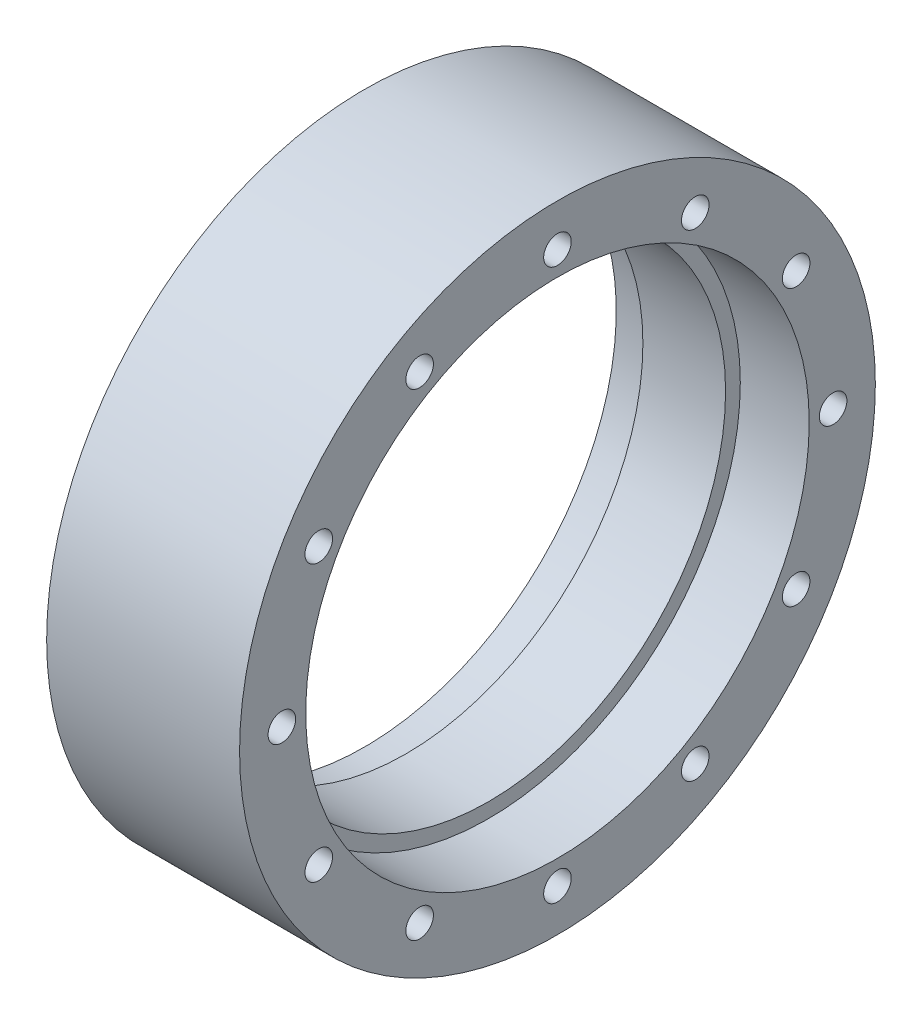
ISO-10303-21;
HEADER;
FILE_DESCRIPTION(('STEP AP214'),'2;1');
FILE_NAME('part.step','',(''),(''),'','','');
FILE_SCHEMA(('AUTOMOTIVE_DESIGN { 1 0 10303 214 1 1 1 1 }'));
ENDSEC;
DATA;
#1=APPLICATION_CONTEXT('core data for automotive mechanical design processes');
#2=APPLICATION_PROTOCOL_DEFINITION('international standard','automotive_design',2000,#1);
#3=PRODUCT_CONTEXT('',#1,'mechanical');
#4=PRODUCT('Part','Part','',(#3));
#5=PRODUCT_RELATED_PRODUCT_CATEGORY('part','',(#4));
#6=PRODUCT_DEFINITION_FORMATION('','',#4);
#7=PRODUCT_DEFINITION_CONTEXT('part definition',#1,'design');
#8=PRODUCT_DEFINITION('design','',#6,#7);
#9=PRODUCT_DEFINITION_SHAPE('','',#8);
#10=(LENGTH_UNIT() NAMED_UNIT(*) SI_UNIT(.MILLI.,.METRE.));
#11=(NAMED_UNIT(*) PLANE_ANGLE_UNIT() SI_UNIT($,.RADIAN.));
#12=(NAMED_UNIT(*) SI_UNIT($,.STERADIAN.) SOLID_ANGLE_UNIT());
#13=UNCERTAINTY_MEASURE_WITH_UNIT(LENGTH_MEASURE(1.E-05),#10,'distance_accuracy_value','');
#14=(GEOMETRIC_REPRESENTATION_CONTEXT(3) GLOBAL_UNCERTAINTY_ASSIGNED_CONTEXT((#13)) GLOBAL_UNIT_ASSIGNED_CONTEXT((#10,
#11,#12)) REPRESENTATION_CONTEXT('',''));
#15=CARTESIAN_POINT('',(0.,0.,0.));
#16=DIRECTION('',(0.,0.,1.));
#17=DIRECTION('',(1.,0.,0.));
#18=AXIS2_PLACEMENT_3D('',#15,#16,#17);
#19=CARTESIAN_POINT('',(12.7,0.,0.));
#20=DIRECTION('',(-1.,0.,0.));
#21=DIRECTION('',(0.,0.,1.));
#22=AXIS2_PLACEMENT_3D('',#19,#20,#21);
#23=CYLINDRICAL_SURFACE('',#22,29.);
#24=CARTESIAN_POINT('',(-4.7625,0.,0.));
#25=DIRECTION('',(1.,0.,0.));
#26=DIRECTION('',(0.,0.,-1.));
#27=AXIS2_PLACEMENT_3D('',#24,#25,#26);
#28=CIRCLE('',#27,29.);
#29=CARTESIAN_POINT('',(-4.7625,0.,-29.));
#30=VERTEX_POINT('',#29);
#31=EDGE_CURVE('E47',#30,#30,#28,.T.);
#32=ORIENTED_EDGE('',*,*,#31,.T.);
#33=EDGE_LOOP('',(#32));
#34=FACE_BOUND('',#33,.T.);
#35=CARTESIAN_POINT('',(-9.525,0.,0.));
#36=DIRECTION('',(-1.,0.,0.));
#37=DIRECTION('',(0.,0.,1.));
#38=AXIS2_PLACEMENT_3D('',#35,#36,#37);
#39=CIRCLE('',#38,29.);
#40=CARTESIAN_POINT('',(-9.525,0.,29.));
#41=VERTEX_POINT('',#40);
#42=EDGE_CURVE('E91',#41,#41,#39,.T.);
#43=ORIENTED_EDGE('',*,*,#42,.T.);
#44=EDGE_LOOP('',(#43));
#45=FACE_BOUND('',#44,.T.);
#46=ADVANCED_FACE('F31',(#34,#45),#23,.F.);
#47=CARTESIAN_POINT('',(12.7,0.,0.));
#48=DIRECTION('',(-1.,0.,0.));
#49=DIRECTION('',(0.,0.,1.));
#50=AXIS2_PLACEMENT_3D('',#47,#48,#49);
#51=CYLINDRICAL_SURFACE('',#50,36.62);
#52=CARTESIAN_POINT('',(12.7,0.,0.));
#53=DIRECTION('',(1.,0.,0.));
#54=DIRECTION('',(0.,0.,-1.));
#55=AXIS2_PLACEMENT_3D('',#52,#53,#54);
#56=CIRCLE('',#55,36.62);
#57=CARTESIAN_POINT('',(12.7,0.,-36.62));
#58=VERTEX_POINT('',#57);
#59=EDGE_CURVE('E39',#58,#58,#56,.T.);
#60=ORIENTED_EDGE('',*,*,#59,.F.);
#61=EDGE_LOOP('',(#60));
#62=FACE_BOUND('',#61,.T.);
#63=CARTESIAN_POINT('',(-9.525,0.,0.));
#64=DIRECTION('',(-1.,0.,0.));
#65=DIRECTION('',(0.,0.,1.));
#66=AXIS2_PLACEMENT_3D('',#63,#64,#65);
#67=CIRCLE('',#66,36.62);
#68=CARTESIAN_POINT('',(-9.525,0.,36.62));
#69=VERTEX_POINT('',#68);
#70=EDGE_CURVE('E100',#69,#69,#67,.T.);
#71=ORIENTED_EDGE('',*,*,#70,.F.);
#72=EDGE_LOOP('',(#71));
#73=FACE_BOUND('',#72,.T.);
#74=ADVANCED_FACE('F33',(#62,#73),#51,.T.);
#75=CARTESIAN_POINT('',(-12.7,27.4963065701561,15.8749999999997));
#76=DIRECTION('',(1.,0.,0.));
#77=DIRECTION('',(0.,0.,-1.));
#78=AXIS2_PLACEMENT_3D('',#75,#76,#77);
#79=CYLINDRICAL_SURFACE('',#78,1.5875);
#80=CARTESIAN_POINT('',(12.7,27.4963065701561,15.8749999999997));
#81=DIRECTION('',(1.,0.,0.));
#82=DIRECTION('',(0.,0.,-1.));
#83=AXIS2_PLACEMENT_3D('',#80,#81,#82);
#84=CIRCLE('',#83,1.5875);
#85=CARTESIAN_POINT('',(12.7,27.4963065701561,14.2874999999997));
#86=VERTEX_POINT('',#85);
#87=EDGE_CURVE('E75',#86,#86,#84,.T.);
#88=ORIENTED_EDGE('',*,*,#87,.T.);
#89=EDGE_LOOP('',(#88));
#90=FACE_BOUND('',#89,.T.);
#91=CARTESIAN_POINT('',(-9.525,27.4963065701561,15.8749999999997));
#92=DIRECTION('',(-1.,0.,0.));
#93=DIRECTION('',(0.,0.,1.));
#94=AXIS2_PLACEMENT_3D('',#91,#92,#93);
#95=CIRCLE('',#94,1.5875);
#96=CARTESIAN_POINT('',(-9.525,27.4963065701561,17.4624999999997));
#97=VERTEX_POINT('',#96);
#98=EDGE_CURVE('E103',#97,#97,#95,.F.);
#99=ORIENTED_EDGE('',*,*,#98,.F.);
#100=EDGE_LOOP('',(#99));
#101=FACE_BOUND('',#100,.T.);
#102=ADVANCED_FACE('F167',(#90,#101),#79,.F.);
#103=CARTESIAN_POINT('',(-12.7,15.8750000000002,27.4963065701558));
#104=DIRECTION('',(1.,0.,0.));
#105=DIRECTION('',(0.,0.,-1.));
#106=AXIS2_PLACEMENT_3D('',#103,#104,#105);
#107=CYLINDRICAL_SURFACE('',#106,1.5875);
#108=CARTESIAN_POINT('',(12.7,15.8750000000002,27.4963065701558));
#109=DIRECTION('',(1.,0.,0.));
#110=DIRECTION('',(0.,0.,-1.));
#111=AXIS2_PLACEMENT_3D('',#108,#109,#110);
#112=CIRCLE('',#111,1.5875);
#113=CARTESIAN_POINT('',(12.7,15.8750000000002,25.9088065701558));
#114=VERTEX_POINT('',#113);
#115=EDGE_CURVE('E78',#114,#114,#112,.T.);
#116=ORIENTED_EDGE('',*,*,#115,.T.);
#117=EDGE_LOOP('',(#116));
#118=FACE_BOUND('',#117,.T.);
#119=CARTESIAN_POINT('',(-9.525,15.8750000000002,27.4963065701558));
#120=DIRECTION('',(-1.,0.,0.));
#121=DIRECTION('',(0.,0.,1.));
#122=AXIS2_PLACEMENT_3D('',#119,#120,#121);
#123=CIRCLE('',#122,1.5875);
#124=CARTESIAN_POINT('',(-9.525,15.8750000000002,29.0838065701558));
#125=VERTEX_POINT('',#124);
#126=EDGE_CURVE('E106',#125,#125,#123,.F.);
#127=ORIENTED_EDGE('',*,*,#126,.F.);
#128=EDGE_LOOP('',(#127));
#129=FACE_BOUND('',#128,.T.);
#130=ADVANCED_FACE('F212',(#118,#129),#107,.F.);
#131=CARTESIAN_POINT('',(-12.7,2.21709065016539E-13,31.75));
#132=DIRECTION('',(1.,0.,0.));
#133=DIRECTION('',(0.,0.,-1.));
#134=AXIS2_PLACEMENT_3D('',#131,#132,#133);
#135=CYLINDRICAL_SURFACE('',#134,1.5875);
#136=CARTESIAN_POINT('',(12.7,2.21709065016539E-13,31.75));
#137=DIRECTION('',(1.,0.,0.));
#138=DIRECTION('',(0.,0.,-1.));
#139=AXIS2_PLACEMENT_3D('',#136,#137,#138);
#140=CIRCLE('',#139,1.5875);
#141=CARTESIAN_POINT('',(12.7,2.21709065016539E-13,30.1625));
#142=VERTEX_POINT('',#141);
#143=EDGE_CURVE('E82',#142,#142,#140,.T.);
#144=ORIENTED_EDGE('',*,*,#143,.T.);
#145=EDGE_LOOP('',(#144));
#146=FACE_BOUND('',#145,.T.);
#147=CARTESIAN_POINT('',(-9.525,2.21709065016539E-13,31.75));
#148=DIRECTION('',(-1.,0.,0.));
#149=DIRECTION('',(0.,0.,1.));
#150=AXIS2_PLACEMENT_3D('',#147,#148,#149);
#151=CIRCLE('',#150,1.5875);
#152=CARTESIAN_POINT('',(-9.525,2.21709065016539E-13,33.3375));
#153=VERTEX_POINT('',#152);
#154=EDGE_CURVE('E109',#153,#153,#151,.F.);
#155=ORIENTED_EDGE('',*,*,#154,.F.);
#156=EDGE_LOOP('',(#155));
#157=FACE_BOUND('',#156,.T.);
#158=ADVANCED_FACE('F216',(#146,#157),#135,.F.);
#159=CARTESIAN_POINT('',(-12.7,-15.8749999999998,27.496306570156));
#160=DIRECTION('',(1.,0.,0.));
#161=DIRECTION('',(0.,0.,-1.));
#162=AXIS2_PLACEMENT_3D('',#159,#160,#161);
#163=CYLINDRICAL_SURFACE('',#162,1.5875);
#164=CARTESIAN_POINT('',(12.7,-15.8749999999998,27.496306570156));
#165=DIRECTION('',(1.,0.,0.));
#166=DIRECTION('',(0.,0.,-1.));
#167=AXIS2_PLACEMENT_3D('',#164,#165,#166);
#168=CIRCLE('',#167,1.5875);
#169=CARTESIAN_POINT('',(12.7,-15.8749999999998,25.908806570156));
#170=VERTEX_POINT('',#169);
#171=EDGE_CURVE('E66',#170,#170,#168,.T.);
#172=ORIENTED_EDGE('',*,*,#171,.T.);
#173=EDGE_LOOP('',(#172));
#174=FACE_BOUND('',#173,.T.);
#175=CARTESIAN_POINT('',(-9.525,-15.8749999999998,27.496306570156));
#176=DIRECTION('',(-1.,0.,0.));
#177=DIRECTION('',(0.,0.,1.));
#178=AXIS2_PLACEMENT_3D('',#175,#176,#177);
#179=CIRCLE('',#178,1.5875);
#180=CARTESIAN_POINT('',(-9.525,-15.8749999999998,29.083806570156));
#181=VERTEX_POINT('',#180);
#182=EDGE_CURVE('E112',#181,#181,#179,.F.);
#183=ORIENTED_EDGE('',*,*,#182,.F.);
#184=EDGE_LOOP('',(#183));
#185=FACE_BOUND('',#184,.T.);
#186=ADVANCED_FACE('F196',(#174,#185),#163,.F.);
#187=CARTESIAN_POINT('',(-12.7,-27.4963065701559,15.8750000000001));
#188=DIRECTION('',(1.,0.,0.));
#189=DIRECTION('',(0.,0.,-1.));
#190=AXIS2_PLACEMENT_3D('',#187,#188,#189);
#191=CYLINDRICAL_SURFACE('',#190,1.5875);
#192=CARTESIAN_POINT('',(12.7,-27.4963065701559,15.8750000000001));
#193=DIRECTION('',(1.,0.,0.));
#194=DIRECTION('',(0.,0.,-1.));
#195=AXIS2_PLACEMENT_3D('',#192,#193,#194);
#196=CIRCLE('',#195,1.5875);
#197=CARTESIAN_POINT('',(12.7,-27.4963065701559,14.2875000000001));
#198=VERTEX_POINT('',#197);
#199=EDGE_CURVE('E62',#198,#198,#196,.T.);
#200=ORIENTED_EDGE('',*,*,#199,.T.);
#201=EDGE_LOOP('',(#200));
#202=FACE_BOUND('',#201,.T.);
#203=CARTESIAN_POINT('',(-9.525,-27.4963065701559,15.8750000000001));
#204=DIRECTION('',(-1.,0.,0.));
#205=DIRECTION('',(0.,0.,1.));
#206=AXIS2_PLACEMENT_3D('',#203,#204,#205);
#207=CIRCLE('',#206,1.5875);
#208=CARTESIAN_POINT('',(-9.525,-27.4963065701559,17.4625000000001));
#209=VERTEX_POINT('',#208);
#210=EDGE_CURVE('E115',#209,#209,#207,.F.);
#211=ORIENTED_EDGE('',*,*,#210,.F.);
#212=EDGE_LOOP('',(#211));
#213=FACE_BOUND('',#212,.T.);
#214=ADVANCED_FACE('F192',(#202,#213),#191,.F.);
#215=CARTESIAN_POINT('',(-12.7,-31.75,1.10854532508269E-13));
#216=DIRECTION('',(1.,0.,0.));
#217=DIRECTION('',(0.,0.,-1.));
#218=AXIS2_PLACEMENT_3D('',#215,#216,#217);
#219=CYLINDRICAL_SURFACE('',#218,1.5875);
#220=CARTESIAN_POINT('',(12.7,-31.75,1.10854532508269E-13));
#221=DIRECTION('',(1.,0.,0.));
#222=DIRECTION('',(0.,0.,-1.));
#223=AXIS2_PLACEMENT_3D('',#220,#221,#222);
#224=CIRCLE('',#223,1.5875);
#225=CARTESIAN_POINT('',(12.7,-31.75,-1.58749999999989));
#226=VERTEX_POINT('',#225);
#227=EDGE_CURVE('E65',#226,#226,#224,.T.);
#228=ORIENTED_EDGE('',*,*,#227,.T.);
#229=EDGE_LOOP('',(#228));
#230=FACE_BOUND('',#229,.T.);
#231=CARTESIAN_POINT('',(-9.525,-31.75,1.10854532508269E-13));
#232=DIRECTION('',(-1.,0.,0.));
#233=DIRECTION('',(0.,0.,1.));
#234=AXIS2_PLACEMENT_3D('',#231,#232,#233);
#235=CIRCLE('',#234,1.5875);
#236=CARTESIAN_POINT('',(-9.525,-31.75,1.58750000000011));
#237=VERTEX_POINT('',#236);
#238=EDGE_CURVE('E118',#237,#237,#235,.F.);
#239=ORIENTED_EDGE('',*,*,#238,.F.);
#240=EDGE_LOOP('',(#239));
#241=FACE_BOUND('',#240,.T.);
#242=ADVANCED_FACE('F195',(#230,#241),#219,.F.);
#243=CARTESIAN_POINT('',(-12.7,-27.496306570156,-15.8749999999999));
#244=DIRECTION('',(1.,0.,0.));
#245=DIRECTION('',(0.,0.,-1.));
#246=AXIS2_PLACEMENT_3D('',#243,#244,#245);
#247=CYLINDRICAL_SURFACE('',#246,1.5875);
#248=CARTESIAN_POINT('',(12.7,-27.496306570156,-15.8749999999999));
#249=DIRECTION('',(1.,0.,0.));
#250=DIRECTION('',(0.,0.,-1.));
#251=AXIS2_PLACEMENT_3D('',#248,#249,#250);
#252=CIRCLE('',#251,1.5875);
#253=CARTESIAN_POINT('',(12.7,-27.496306570156,-17.4624999999999));
#254=VERTEX_POINT('',#253);
#255=EDGE_CURVE('E69',#254,#254,#252,.T.);
#256=ORIENTED_EDGE('',*,*,#255,.T.);
#257=EDGE_LOOP('',(#256));
#258=FACE_BOUND('',#257,.T.);
#259=CARTESIAN_POINT('',(-9.525,-27.496306570156,-15.8749999999999));
#260=DIRECTION('',(-1.,0.,0.));
#261=DIRECTION('',(0.,0.,1.));
#262=AXIS2_PLACEMENT_3D('',#259,#260,#261);
#263=CIRCLE('',#262,1.5875);
#264=CARTESIAN_POINT('',(-9.525,-27.496306570156,-14.2874999999999));
#265=VERTEX_POINT('',#264);
#266=EDGE_CURVE('E121',#265,#265,#263,.F.);
#267=ORIENTED_EDGE('',*,*,#266,.F.);
#268=EDGE_LOOP('',(#267));
#269=FACE_BOUND('',#268,.T.);
#270=ADVANCED_FACE('F200',(#258,#269),#247,.F.);
#271=CARTESIAN_POINT('',(-12.7,-15.875,-27.4963065701559));
#272=DIRECTION('',(1.,0.,0.));
#273=DIRECTION('',(0.,0.,-1.));
#274=AXIS2_PLACEMENT_3D('',#271,#272,#273);
#275=CYLINDRICAL_SURFACE('',#274,1.5875);
#276=CARTESIAN_POINT('',(12.7,-15.875,-27.4963065701559));
#277=DIRECTION('',(1.,0.,0.));
#278=DIRECTION('',(0.,0.,-1.));
#279=AXIS2_PLACEMENT_3D('',#276,#277,#278);
#280=CIRCLE('',#279,1.5875);
#281=CARTESIAN_POINT('',(12.7,-15.875,-29.0838065701559));
#282=VERTEX_POINT('',#281);
#283=EDGE_CURVE('E72',#282,#282,#280,.T.);
#284=ORIENTED_EDGE('',*,*,#283,.T.);
#285=EDGE_LOOP('',(#284));
#286=FACE_BOUND('',#285,.T.);
#287=CARTESIAN_POINT('',(-9.525,-15.875,-27.4963065701559));
#288=DIRECTION('',(-1.,0.,0.));
#289=DIRECTION('',(0.,0.,1.));
#290=AXIS2_PLACEMENT_3D('',#287,#288,#289);
#291=CIRCLE('',#290,1.5875);
#292=CARTESIAN_POINT('',(-9.525,-15.875,-25.9088065701559));
#293=VERTEX_POINT('',#292);
#294=EDGE_CURVE('E124',#293,#293,#291,.F.);
#295=ORIENTED_EDGE('',*,*,#294,.F.);
#296=EDGE_LOOP('',(#295));
#297=FACE_BOUND('',#296,.T.);
#298=ADVANCED_FACE('F204',(#286,#297),#275,.F.);
#299=CARTESIAN_POINT('',(-12.7,31.75,-3.32563597524808E-13));
#300=DIRECTION('',(1.,0.,0.));
#301=DIRECTION('',(0.,0.,-1.));
#302=AXIS2_PLACEMENT_3D('',#299,#300,#301);
#303=CYLINDRICAL_SURFACE('',#302,1.5875);
#304=CARTESIAN_POINT('',(12.7,31.75,-3.32563597524808E-13));
#305=DIRECTION('',(1.,0.,0.));
#306=DIRECTION('',(0.,0.,-1.));
#307=AXIS2_PLACEMENT_3D('',#304,#305,#306);
#308=CIRCLE('',#307,1.5875);
#309=CARTESIAN_POINT('',(12.7,31.75,-1.58750000000033));
#310=VERTEX_POINT('',#309);
#311=EDGE_CURVE('E79',#310,#310,#308,.T.);
#312=ORIENTED_EDGE('',*,*,#311,.T.);
#313=EDGE_LOOP('',(#312));
#314=FACE_BOUND('',#313,.T.);
#315=CARTESIAN_POINT('',(-9.525,31.75,-3.32563597524808E-13));
#316=DIRECTION('',(-1.,0.,0.));
#317=DIRECTION('',(0.,0.,1.));
#318=AXIS2_PLACEMENT_3D('',#315,#316,#317);
#319=CIRCLE('',#318,1.5875);
#320=CARTESIAN_POINT('',(-9.525,31.75,1.58749999999967));
#321=VERTEX_POINT('',#320);
#322=EDGE_CURVE('E127',#321,#321,#319,.F.);
#323=ORIENTED_EDGE('',*,*,#322,.F.);
#324=EDGE_LOOP('',(#323));
#325=FACE_BOUND('',#324,.T.);
#326=ADVANCED_FACE('F208',(#314,#325),#303,.F.);
#327=CARTESIAN_POINT('',(-12.7,27.4963065701557,-15.8750000000003));
#328=DIRECTION('',(1.,0.,0.));
#329=DIRECTION('',(0.,0.,-1.));
#330=AXIS2_PLACEMENT_3D('',#327,#328,#329);
#331=CYLINDRICAL_SURFACE('',#330,1.5875);
#332=CARTESIAN_POINT('',(12.7,27.4963065701557,-15.8750000000003));
#333=DIRECTION('',(1.,0.,0.));
#334=DIRECTION('',(0.,0.,-1.));
#335=AXIS2_PLACEMENT_3D('',#332,#333,#334);
#336=CIRCLE('',#335,1.5875);
#337=CARTESIAN_POINT('',(12.7,27.4963065701557,-17.4625000000003));
#338=VERTEX_POINT('',#337);
#339=EDGE_CURVE('E90',#338,#338,#336,.T.);
#340=ORIENTED_EDGE('',*,*,#339,.T.);
#341=EDGE_LOOP('',(#340));
#342=FACE_BOUND('',#341,.T.);
#343=CARTESIAN_POINT('',(-9.525,27.4963065701557,-15.8750000000003));
#344=DIRECTION('',(-1.,0.,0.));
#345=DIRECTION('',(0.,0.,1.));
#346=AXIS2_PLACEMENT_3D('',#343,#344,#345);
#347=CIRCLE('',#346,1.5875);
#348=CARTESIAN_POINT('',(-9.525,27.4963065701557,-14.2875000000003));
#349=VERTEX_POINT('',#348);
#350=EDGE_CURVE('E130',#349,#349,#347,.F.);
#351=ORIENTED_EDGE('',*,*,#350,.F.);
#352=EDGE_LOOP('',(#351));
#353=FACE_BOUND('',#352,.T.);
#354=ADVANCED_FACE('F156',(#342,#353),#331,.F.);
#355=CARTESIAN_POINT('',(-12.7,15.8749999999996,-27.4963065701561));
#356=DIRECTION('',(1.,0.,0.));
#357=DIRECTION('',(0.,0.,-1.));
#358=AXIS2_PLACEMENT_3D('',#355,#356,#357);
#359=CYLINDRICAL_SURFACE('',#358,1.5875);
#360=CARTESIAN_POINT('',(12.7,15.8749999999996,-27.4963065701561));
#361=DIRECTION('',(1.,0.,0.));
#362=DIRECTION('',(0.,0.,-1.));
#363=AXIS2_PLACEMENT_3D('',#360,#361,#362);
#364=CIRCLE('',#363,1.5875);
#365=CARTESIAN_POINT('',(12.7,15.8749999999996,-29.0838065701561));
#366=VERTEX_POINT('',#365);
#367=EDGE_CURVE('E87',#366,#366,#364,.T.);
#368=ORIENTED_EDGE('',*,*,#367,.T.);
#369=EDGE_LOOP('',(#368));
#370=FACE_BOUND('',#369,.T.);
#371=CARTESIAN_POINT('',(-9.525,15.8749999999996,-27.4963065701561));
#372=DIRECTION('',(-1.,0.,0.));
#373=DIRECTION('',(0.,0.,1.));
#374=AXIS2_PLACEMENT_3D('',#371,#372,#373);
#375=CIRCLE('',#374,1.5875);
#376=CARTESIAN_POINT('',(-9.525,15.8749999999996,-25.9088065701561));
#377=VERTEX_POINT('',#376);
#378=EDGE_CURVE('E133',#377,#377,#375,.F.);
#379=ORIENTED_EDGE('',*,*,#378,.F.);
#380=EDGE_LOOP('',(#379));
#381=FACE_BOUND('',#380,.T.);
#382=ADVANCED_FACE('F146',(#370,#381),#359,.F.);
#383=CARTESIAN_POINT('',(-12.7,0.,-31.75));
#384=DIRECTION('',(1.,0.,0.));
#385=DIRECTION('',(0.,0.,-1.));
#386=AXIS2_PLACEMENT_3D('',#383,#384,#385);
#387=CYLINDRICAL_SURFACE('',#386,1.5875);
#388=CARTESIAN_POINT('',(12.7,0.,-31.75));
#389=DIRECTION('',(1.,0.,0.));
#390=DIRECTION('',(0.,0.,-1.));
#391=AXIS2_PLACEMENT_3D('',#388,#389,#390);
#392=CIRCLE('',#391,1.5875);
#393=CARTESIAN_POINT('',(12.7,0.,-33.3375));
#394=VERTEX_POINT('',#393);
#395=EDGE_CURVE('E59',#394,#394,#392,.T.);
#396=ORIENTED_EDGE('',*,*,#395,.T.);
#397=EDGE_LOOP('',(#396));
#398=FACE_BOUND('',#397,.T.);
#399=CARTESIAN_POINT('',(-9.525,0.,-31.75));
#400=DIRECTION('',(-1.,0.,0.));
#401=DIRECTION('',(0.,0.,1.));
#402=AXIS2_PLACEMENT_3D('',#399,#400,#401);
#403=CIRCLE('',#402,1.5875);
#404=CARTESIAN_POINT('',(-9.525,0.,-30.1625));
#405=VERTEX_POINT('',#404);
#406=EDGE_CURVE('E35',#405,#405,#403,.F.);
#407=ORIENTED_EDGE('',*,*,#406,.F.);
#408=EDGE_LOOP('',(#407));
#409=FACE_BOUND('',#408,.T.);
#410=ADVANCED_FACE('F143',(#398,#409),#387,.F.);
#411=CARTESIAN_POINT('',(12.7,0.,0.));
#412=DIRECTION('',(1.,0.,0.));
#413=DIRECTION('',(0.,0.,-1.));
#414=AXIS2_PLACEMENT_3D('',#411,#412,#413);
#415=PLANE('',#414);
#416=ORIENTED_EDGE('',*,*,#395,.F.);
#417=EDGE_LOOP('',(#416));
#418=FACE_BOUND('',#417,.T.);
#419=ORIENTED_EDGE('',*,*,#367,.F.);
#420=EDGE_LOOP('',(#419));
#421=FACE_BOUND('',#420,.T.);
#422=ORIENTED_EDGE('',*,*,#339,.F.);
#423=EDGE_LOOP('',(#422));
#424=FACE_BOUND('',#423,.T.);
#425=ORIENTED_EDGE('',*,*,#311,.F.);
#426=EDGE_LOOP('',(#425));
#427=FACE_BOUND('',#426,.T.);
#428=ORIENTED_EDGE('',*,*,#283,.F.);
#429=EDGE_LOOP('',(#428));
#430=FACE_BOUND('',#429,.T.);
#431=ORIENTED_EDGE('',*,*,#255,.F.);
#432=EDGE_LOOP('',(#431));
#433=FACE_BOUND('',#432,.T.);
#434=ORIENTED_EDGE('',*,*,#227,.F.);
#435=EDGE_LOOP('',(#434));
#436=FACE_BOUND('',#435,.T.);
#437=ORIENTED_EDGE('',*,*,#199,.F.);
#438=EDGE_LOOP('',(#437));
#439=FACE_BOUND('',#438,.T.);
#440=ORIENTED_EDGE('',*,*,#171,.F.);
#441=EDGE_LOOP('',(#440));
#442=FACE_BOUND('',#441,.T.);
#443=ORIENTED_EDGE('',*,*,#143,.F.);
#444=EDGE_LOOP('',(#443));
#445=FACE_BOUND('',#444,.T.);
#446=ORIENTED_EDGE('',*,*,#115,.F.);
#447=EDGE_LOOP('',(#446));
#448=FACE_BOUND('',#447,.T.);
#449=ORIENTED_EDGE('',*,*,#87,.F.);
#450=EDGE_LOOP('',(#449));
#451=FACE_BOUND('',#450,.T.);
#452=ORIENTED_EDGE('',*,*,#59,.T.);
#453=EDGE_LOOP('',(#452));
#454=FACE_BOUND('',#453,.T.);
#455=CARTESIAN_POINT('',(12.7,0.,0.));
#456=DIRECTION('',(1.,0.,0.));
#457=DIRECTION('',(0.,0.,-1.));
#458=AXIS2_PLACEMENT_3D('',#455,#456,#457);
#459=CIRCLE('',#458,29.);
#460=CARTESIAN_POINT('',(12.7,0.,-29.));
#461=VERTEX_POINT('',#460);
#462=EDGE_CURVE('E44',#461,#461,#459,.T.);
#463=ORIENTED_EDGE('',*,*,#462,.F.);
#464=EDGE_LOOP('',(#463));
#465=FACE_BOUND('',#464,.T.);
#466=ADVANCED_FACE('F145',(#418,#421,#424,#427,#430,#433,#436,#439,#442,#445,#448,#451,#454,
#465),#415,.T.);
#467=CARTESIAN_POINT('',(4.7625,0.,0.));
#468=DIRECTION('',(1.,0.,0.));
#469=DIRECTION('',(0.,0.,-1.));
#470=AXIS2_PLACEMENT_3D('',#467,#468,#469);
#471=CIRCLE('',#470,29.);
#472=CARTESIAN_POINT('',(4.7625,0.,-29.));
#473=VERTEX_POINT('',#472);
#474=EDGE_CURVE('E10',#473,#473,#471,.T.);
#475=ORIENTED_EDGE('',*,*,#474,.F.);
#476=EDGE_LOOP('',(#475));
#477=FACE_BOUND('',#476,.T.);
#478=ORIENTED_EDGE('',*,*,#462,.T.);
#479=EDGE_LOOP('',(#478));
#480=FACE_BOUND('',#479,.T.);
#481=ADVANCED_FACE('F154',(#477,#480),#23,.F.);
#482=CARTESIAN_POINT('',(-4.7625,0.,0.));
#483=DIRECTION('',(1.,0.,0.));
#484=DIRECTION('',(0.,0.,-1.));
#485=AXIS2_PLACEMENT_3D('',#482,#483,#484);
#486=PLANE('',#485);
#487=CARTESIAN_POINT('',(-4.7625,0.,0.));
#488=DIRECTION('',(1.,0.,0.));
#489=DIRECTION('',(0.,0.,-1.));
#490=AXIS2_PLACEMENT_3D('',#487,#488,#489);
#491=CIRCLE('',#490,27.305);
#492=CARTESIAN_POINT('',(-4.7625,0.,-27.305));
#493=VERTEX_POINT('',#492);
#494=EDGE_CURVE('E49',#493,#493,#491,.T.);
#495=ORIENTED_EDGE('',*,*,#494,.T.);
#496=EDGE_LOOP('',(#495));
#497=FACE_BOUND('',#496,.T.);
#498=ORIENTED_EDGE('',*,*,#31,.F.);
#499=EDGE_LOOP('',(#498));
#500=FACE_BOUND('',#499,.T.);
#501=ADVANCED_FACE('F172',(#497,#500),#486,.F.);
#502=CARTESIAN_POINT('',(4.7625,0.,0.));
#503=DIRECTION('',(1.,0.,0.));
#504=DIRECTION('',(0.,0.,-1.));
#505=AXIS2_PLACEMENT_3D('',#502,#503,#504);
#506=PLANE('',#505);
#507=CARTESIAN_POINT('',(4.7625,0.,0.));
#508=DIRECTION('',(1.,0.,0.));
#509=DIRECTION('',(0.,0.,-1.));
#510=AXIS2_PLACEMENT_3D('',#507,#508,#509);
#511=CIRCLE('',#510,27.305);
#512=CARTESIAN_POINT('',(4.7625,0.,-27.305));
#513=VERTEX_POINT('',#512);
#514=EDGE_CURVE('E54',#513,#513,#511,.T.);
#515=ORIENTED_EDGE('',*,*,#514,.F.);
#516=EDGE_LOOP('',(#515));
#517=FACE_BOUND('',#516,.T.);
#518=ORIENTED_EDGE('',*,*,#474,.T.);
#519=EDGE_LOOP('',(#518));
#520=FACE_BOUND('',#519,.T.);
#521=ADVANCED_FACE('F177',(#517,#520),#506,.T.);
#522=CARTESIAN_POINT('',(-4.7625,0.,0.));
#523=DIRECTION('',(1.,0.,0.));
#524=DIRECTION('',(0.,0.,-1.));
#525=AXIS2_PLACEMENT_3D('',#522,#523,#524);
#526=CYLINDRICAL_SURFACE('',#525,27.305);
#527=CARTESIAN_POINT('',(-4.7625,0.,-27.305));
#528=CARTESIAN_POINT('',(-4.66328125,0.,-27.305));
#529=CARTESIAN_POINT('',(-4.5640625,0.,-27.305));
#530=CARTESIAN_POINT('',(-4.365625,0.,-27.305));
#531=CARTESIAN_POINT('',(-4.26640625,0.,-27.305));
#532=CARTESIAN_POINT('',(-4.06796875,0.,-27.305));
#533=CARTESIAN_POINT('',(-3.96875,0.,-27.305));
#534=CARTESIAN_POINT('',(-3.7703125,0.,-27.305));
#535=CARTESIAN_POINT('',(-3.67109375,0.,-27.305));
#536=CARTESIAN_POINT('',(-3.47265625,0.,-27.305));
#537=CARTESIAN_POINT('',(-3.3734375,0.,-27.305));
#538=CARTESIAN_POINT('',(-3.175,0.,-27.305));
#539=CARTESIAN_POINT('',(-3.07578125,0.,-27.305));
#540=CARTESIAN_POINT('',(-2.87734375,0.,-27.305));
#541=CARTESIAN_POINT('',(-2.778125,0.,-27.305));
#542=CARTESIAN_POINT('',(-2.5796875,0.,-27.305));
#543=CARTESIAN_POINT('',(-2.48046875,0.,-27.305));
#544=CARTESIAN_POINT('',(-2.28203125,0.,-27.305));
#545=CARTESIAN_POINT('',(-2.1828125,0.,-27.305));
#546=CARTESIAN_POINT('',(-1.984375,0.,-27.305));
#547=CARTESIAN_POINT('',(-1.88515625,0.,-27.305));
#548=CARTESIAN_POINT('',(-1.68671875,0.,-27.305));
#549=CARTESIAN_POINT('',(-1.5875,0.,-27.305));
#550=CARTESIAN_POINT('',(-1.3890625,0.,-27.305));
#551=CARTESIAN_POINT('',(-1.28984375,0.,-27.305));
#552=CARTESIAN_POINT('',(-1.09140625,0.,-27.305));
#553=CARTESIAN_POINT('',(-0.9921875,0.,-27.305));
#554=CARTESIAN_POINT('',(-0.793750000000001,0.,-27.305));
#555=CARTESIAN_POINT('',(-0.694531250000001,0.,-27.305));
#556=CARTESIAN_POINT('',(-0.496093750000001,0.,-27.305));
#557=CARTESIAN_POINT('',(-0.396875000000001,0.,-27.305));
#558=CARTESIAN_POINT('',(-0.198437500000001,0.,-27.305));
#559=CARTESIAN_POINT('',(-0.0992187500000009,0.,-27.305));
#560=CARTESIAN_POINT('',(0.0992187499999992,0.,-27.305));
#561=CARTESIAN_POINT('',(0.198437499999999,0.,-27.305));
#562=CARTESIAN_POINT('',(0.396874999999999,0.,-27.305));
#563=CARTESIAN_POINT('',(0.496093749999999,0.,-27.305));
#564=CARTESIAN_POINT('',(0.694531249999999,0.,-27.305));
#565=CARTESIAN_POINT('',(0.79375,0.,-27.305));
#566=CARTESIAN_POINT('',(0.9921875,0.,-27.305));
#567=CARTESIAN_POINT('',(1.09140625,0.,-27.305));
#568=CARTESIAN_POINT('',(1.28984375,0.,-27.305));
#569=CARTESIAN_POINT('',(1.3890625,0.,-27.305));
#570=CARTESIAN_POINT('',(1.5875,0.,-27.305));
#571=CARTESIAN_POINT('',(1.68671875,0.,-27.305));
#572=CARTESIAN_POINT('',(1.88515625,0.,-27.305));
#573=CARTESIAN_POINT('',(1.984375,0.,-27.305));
#574=CARTESIAN_POINT('',(2.1828125,0.,-27.305));
#575=CARTESIAN_POINT('',(2.28203125,0.,-27.305));
#576=CARTESIAN_POINT('',(2.48046875,0.,-27.305));
#577=CARTESIAN_POINT('',(2.5796875,0.,-27.305));
#578=CARTESIAN_POINT('',(2.778125,0.,-27.305));
#579=CARTESIAN_POINT('',(2.87734375,0.,-27.305));
#580=CARTESIAN_POINT('',(3.07578125,0.,-27.305));
#581=CARTESIAN_POINT('',(3.175,0.,-27.305));
#582=CARTESIAN_POINT('',(3.3734375,0.,-27.305));
#583=CARTESIAN_POINT('',(3.47265625,0.,-27.305));
#584=CARTESIAN_POINT('',(3.67109375,0.,-27.305));
#585=CARTESIAN_POINT('',(3.7703125,0.,-27.305));
#586=CARTESIAN_POINT('',(3.96875,0.,-27.305));
#587=CARTESIAN_POINT('',(4.06796875,0.,-27.305));
#588=CARTESIAN_POINT('',(4.26640625,0.,-27.305));
#589=CARTESIAN_POINT('',(4.365625,0.,-27.305));
#590=CARTESIAN_POINT('',(4.5640625,0.,-27.305));
#591=CARTESIAN_POINT('',(4.66328125,0.,-27.305));
#592=CARTESIAN_POINT('',(4.7625,0.,-27.305));
#593=B_SPLINE_CURVE_WITH_KNOTS('',3,(#527,#528,#529,#530,#531,#532,#533,#534,#535,#536,#537,
#538,#539,#540,#541,#542,#543,#544,#545,#546,#547,#548,#549,#550,#551,#552,#553,#554,#555,#556,
#557,#558,#559,#560,#561,#562,#563,#564,#565,#566,#567,#568,#569,#570,#571,#572,#573,#574,#575,
#576,#577,#578,#579,#580,#581,#582,#583,#584,#585,#586,#587,#588,#589,#590,#591,#592),
.UNSPECIFIED.,.F.,.F.,(4,2,2,2,2,2,2,2,2,2,2,2,2,2,2,2,2,2,2,2,2,2,2,2,2,2,2,2,2,2,2,2,4),(0.,
0.29765625,0.5953125,0.892968750000001,1.190625,1.48828125,1.7859375,2.08359375,2.38125,
2.67890625,2.9765625,3.27421875,3.571875,3.86953125,4.1671875,4.46484375,4.7625,5.06015625,
5.3578125,5.65546875,5.953125,6.25078125,6.5484375,6.84609375,7.14375,7.44140625,7.7390625,
8.03671875,8.334375,8.63203125,8.9296875,9.22734375,9.525),.UNSPECIFIED.);
#594=EDGE_CURVE('BSEAM185',#493,#513,#593,.T.);
#595=ORIENTED_EDGE('',*,*,#494,.F.);
#596=ORIENTED_EDGE('',*,*,#514,.T.);
#597=ORIENTED_EDGE('',*,*,#594,.T.);
#598=ORIENTED_EDGE('',*,*,#594,.F.);
#599=EDGE_LOOP('',(#595,#597,#596,#598));
#600=FACE_BOUND('',#599,.T.);
#601=ADVANCED_FACE('F185',(#600),#526,.F.);
#602=CARTESIAN_POINT('',(-9.525,0.,0.));
#603=DIRECTION('',(-1.,0.,0.));
#604=DIRECTION('',(0.,0.,1.));
#605=AXIS2_PLACEMENT_3D('',#602,#603,#604);
#606=PLANE('',#605);
#607=ORIENTED_EDGE('',*,*,#42,.F.);
#608=EDGE_LOOP('',(#607));
#609=FACE_BOUND('',#608,.T.);
#610=ORIENTED_EDGE('',*,*,#98,.T.);
#611=EDGE_LOOP('',(#610));
#612=FACE_BOUND('',#611,.T.);
#613=ORIENTED_EDGE('',*,*,#126,.T.);
#614=EDGE_LOOP('',(#613));
#615=FACE_BOUND('',#614,.T.);
#616=ORIENTED_EDGE('',*,*,#154,.T.);
#617=EDGE_LOOP('',(#616));
#618=FACE_BOUND('',#617,.T.);
#619=ORIENTED_EDGE('',*,*,#182,.T.);
#620=EDGE_LOOP('',(#619));
#621=FACE_BOUND('',#620,.T.);
#622=ORIENTED_EDGE('',*,*,#210,.T.);
#623=EDGE_LOOP('',(#622));
#624=FACE_BOUND('',#623,.T.);
#625=ORIENTED_EDGE('',*,*,#238,.T.);
#626=EDGE_LOOP('',(#625));
#627=FACE_BOUND('',#626,.T.);
#628=ORIENTED_EDGE('',*,*,#266,.T.);
#629=EDGE_LOOP('',(#628));
#630=FACE_BOUND('',#629,.T.);
#631=ORIENTED_EDGE('',*,*,#294,.T.);
#632=EDGE_LOOP('',(#631));
#633=FACE_BOUND('',#632,.T.);
#634=ORIENTED_EDGE('',*,*,#322,.T.);
#635=EDGE_LOOP('',(#634));
#636=FACE_BOUND('',#635,.T.);
#637=ORIENTED_EDGE('',*,*,#350,.T.);
#638=EDGE_LOOP('',(#637));
#639=FACE_BOUND('',#638,.T.);
#640=ORIENTED_EDGE('',*,*,#378,.T.);
#641=EDGE_LOOP('',(#640));
#642=FACE_BOUND('',#641,.T.);
#643=ORIENTED_EDGE('',*,*,#406,.T.);
#644=EDGE_LOOP('',(#643));
#645=FACE_BOUND('',#644,.T.);
#646=ORIENTED_EDGE('',*,*,#70,.T.);
#647=EDGE_LOOP('',(#646));
#648=FACE_BOUND('',#647,.T.);
#649=ADVANCED_FACE('F140',(#609,#612,#615,#618,#621,#624,#627,#630,#633,#636,#639,#642,#645,
#648),#606,.T.);
#650=CLOSED_SHELL('',(#46,#74,#102,#130,#158,#186,#214,#242,#270,#298,#326,#354,#382,#410,#466,
#481,#501,#521,#601,#649));
#651=MANIFOLD_SOLID_BREP('B2',#650);
#652=ADVANCED_BREP_SHAPE_REPRESENTATION('',(#18,#651),#14);
#653=SHAPE_DEFINITION_REPRESENTATION(#9,#652);
ENDSEC;
END-ISO-10303-21;
